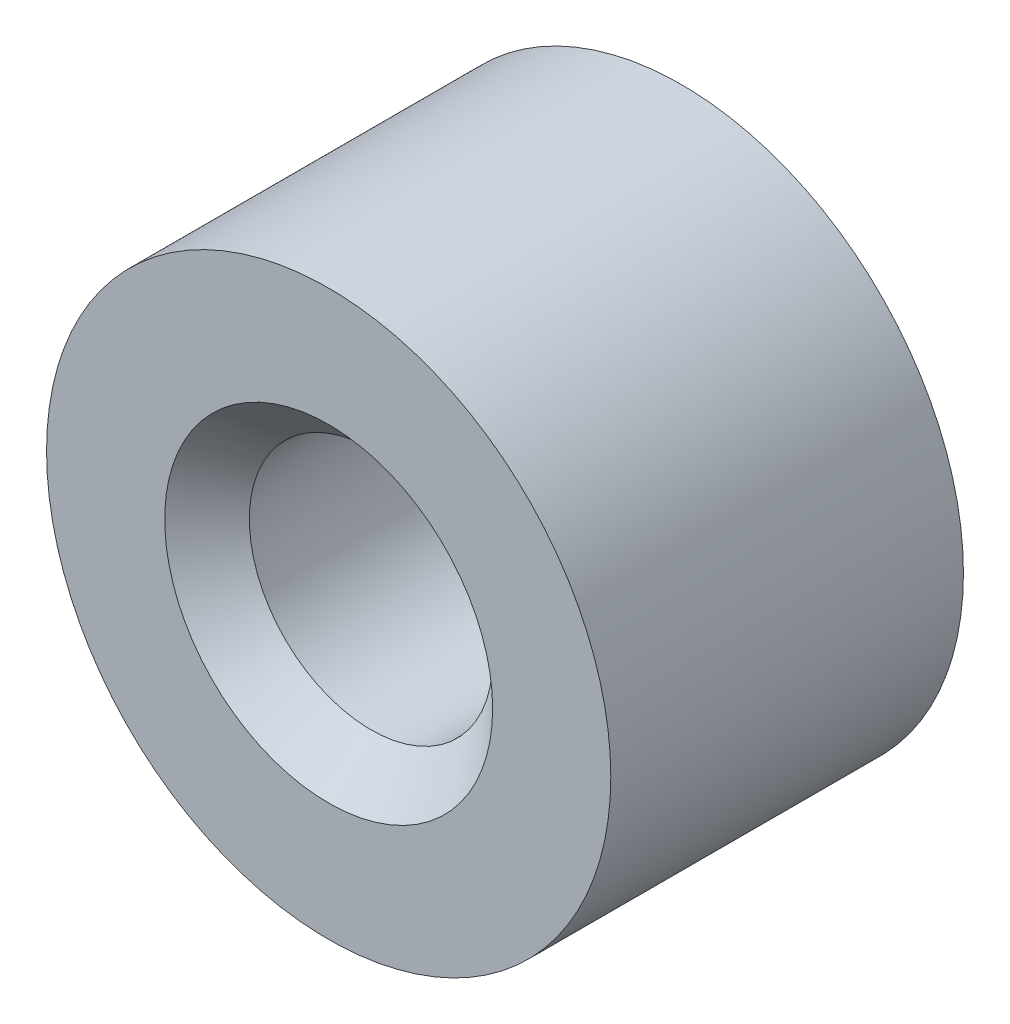
ISO-10303-21;
HEADER;
FILE_DESCRIPTION(('STEP AP214'),'2;1');
FILE_NAME('part.step','',(''),(''),'','','');
FILE_SCHEMA(('AUTOMOTIVE_DESIGN { 1 0 10303 214 1 1 1 1 }'));
ENDSEC;
DATA;
#1=APPLICATION_CONTEXT('core data for automotive mechanical design processes');
#2=APPLICATION_PROTOCOL_DEFINITION('international standard','automotive_design',2000,#1);
#3=PRODUCT_CONTEXT('',#1,'mechanical');
#4=PRODUCT('Part','Part','',(#3));
#5=PRODUCT_RELATED_PRODUCT_CATEGORY('part','',(#4));
#6=PRODUCT_DEFINITION_FORMATION('','',#4);
#7=PRODUCT_DEFINITION_CONTEXT('part definition',#1,'design');
#8=PRODUCT_DEFINITION('design','',#6,#7);
#9=PRODUCT_DEFINITION_SHAPE('','',#8);
#10=(LENGTH_UNIT() NAMED_UNIT(*) SI_UNIT(.MILLI.,.METRE.));
#11=(NAMED_UNIT(*) PLANE_ANGLE_UNIT() SI_UNIT($,.RADIAN.));
#12=(NAMED_UNIT(*) SI_UNIT($,.STERADIAN.) SOLID_ANGLE_UNIT());
#13=UNCERTAINTY_MEASURE_WITH_UNIT(LENGTH_MEASURE(1.E-05),#10,'distance_accuracy_value','');
#14=(GEOMETRIC_REPRESENTATION_CONTEXT(3) GLOBAL_UNCERTAINTY_ASSIGNED_CONTEXT((#13)) GLOBAL_UNIT_ASSIGNED_CONTEXT((#10,
#11,#12)) REPRESENTATION_CONTEXT('',''));
#15=CARTESIAN_POINT('',(0.,0.,0.));
#16=DIRECTION('',(0.,0.,1.));
#17=DIRECTION('',(1.,0.,0.));
#18=AXIS2_PLACEMENT_3D('',#15,#16,#17);
#19=CARTESIAN_POINT('',(0.,0.,-2.5));
#20=DIRECTION('',(0.,0.,-1.));
#21=DIRECTION('',(1.,0.,0.));
#22=AXIS2_PLACEMENT_3D('',#19,#20,#21);
#23=PLANE('',#22);
#24=CARTESIAN_POINT('',(0.,0.,-2.5));
#25=DIRECTION('',(0.,0.,1.));
#26=DIRECTION('',(1.,0.,0.));
#27=AXIS2_PLACEMENT_3D('',#24,#25,#26);
#28=CIRCLE('',#27,2.325);
#29=CARTESIAN_POINT('',(2.325,0.,-2.5));
#30=VERTEX_POINT('',#29);
#31=EDGE_CURVE('E10',#30,#30,#28,.F.);
#32=ORIENTED_EDGE('',*,*,#31,.F.);
#33=EDGE_LOOP('',(#32));
#34=FACE_BOUND('',#33,.T.);
#35=CARTESIAN_POINT('',(0.,0.,-2.5));
#36=DIRECTION('',(0.,0.,1.));
#37=DIRECTION('',(1.,0.,0.));
#38=AXIS2_PLACEMENT_3D('',#35,#36,#37);
#39=CIRCLE('',#38,4.);
#40=CARTESIAN_POINT('',(4.,0.,-2.5));
#41=VERTEX_POINT('',#40);
#42=EDGE_CURVE('E59',#41,#41,#39,.T.);
#43=ORIENTED_EDGE('',*,*,#42,.F.);
#44=EDGE_LOOP('',(#43));
#45=FACE_BOUND('',#44,.T.);
#46=ADVANCED_FACE('F39',(#34,#45),#23,.T.);
#47=CARTESIAN_POINT('',(0.,0.,2.5));
#48=DIRECTION('',(0.,0.,-1.));
#49=DIRECTION('',(1.,0.,0.));
#50=AXIS2_PLACEMENT_3D('',#47,#48,#49);
#51=PLANE('',#50);
#52=CARTESIAN_POINT('',(0.,0.,2.5));
#53=DIRECTION('',(0.,0.,1.));
#54=DIRECTION('',(1.,0.,0.));
#55=AXIS2_PLACEMENT_3D('',#52,#53,#54);
#56=CIRCLE('',#55,2.325);
#57=CARTESIAN_POINT('',(2.325,0.,2.5));
#58=VERTEX_POINT('',#57);
#59=EDGE_CURVE('E54',#58,#58,#56,.T.);
#60=ORIENTED_EDGE('',*,*,#59,.F.);
#61=EDGE_LOOP('',(#60));
#62=FACE_BOUND('',#61,.T.);
#63=CARTESIAN_POINT('',(0.,0.,2.5));
#64=DIRECTION('',(0.,0.,1.));
#65=DIRECTION('',(1.,0.,0.));
#66=AXIS2_PLACEMENT_3D('',#63,#64,#65);
#67=CIRCLE('',#66,4.);
#68=CARTESIAN_POINT('',(4.,0.,2.5));
#69=VERTEX_POINT('',#68);
#70=EDGE_CURVE('E60',#69,#69,#67,.T.);
#71=ORIENTED_EDGE('',*,*,#70,.T.);
#72=EDGE_LOOP('',(#71));
#73=FACE_BOUND('',#72,.T.);
#74=ADVANCED_FACE('F70',(#62,#73),#51,.F.);
#75=CARTESIAN_POINT('',(0.,0.,-2.5));
#76=DIRECTION('',(0.,0.,1.));
#77=DIRECTION('',(-1.,0.,0.));
#78=AXIS2_PLACEMENT_3D('',#75,#76,#77);
#79=CYLINDRICAL_SURFACE('',#78,4.);
#80=ORIENTED_EDGE('',*,*,#42,.T.);
#81=EDGE_LOOP('',(#80));
#82=FACE_BOUND('',#81,.T.);
#83=ORIENTED_EDGE('',*,*,#70,.F.);
#84=EDGE_LOOP('',(#83));
#85=FACE_BOUND('',#84,.T.);
#86=ADVANCED_FACE('F66',(#82,#85),#79,.T.);
#87=CARTESIAN_POINT('',(0.,0.,-2.5));
#88=DIRECTION('',(0.,0.,1.));
#89=DIRECTION('',(-1.,0.,0.));
#90=AXIS2_PLACEMENT_3D('',#87,#88,#89);
#91=CYLINDRICAL_SURFACE('',#90,1.725);
#92=CARTESIAN_POINT('',(0.,0.,1.9));
#93=DIRECTION('',(0.,0.,1.));
#94=DIRECTION('',(1.,0.,0.));
#95=AXIS2_PLACEMENT_3D('',#92,#93,#94);
#96=CIRCLE('',#95,1.725);
#97=CARTESIAN_POINT('',(1.725,0.,1.9));
#98=VERTEX_POINT('',#97);
#99=EDGE_CURVE('E46',#98,#98,#96,.F.);
#100=ORIENTED_EDGE('',*,*,#99,.F.);
#101=EDGE_LOOP('',(#100));
#102=FACE_BOUND('',#101,.T.);
#103=CARTESIAN_POINT('',(0.,0.,-1.9));
#104=DIRECTION('',(0.,0.,1.));
#105=DIRECTION('',(1.,0.,0.));
#106=AXIS2_PLACEMENT_3D('',#103,#104,#105);
#107=CIRCLE('',#106,1.725);
#108=CARTESIAN_POINT('',(1.725,0.,-1.9));
#109=VERTEX_POINT('',#108);
#110=EDGE_CURVE('E50',#109,#109,#107,.T.);
#111=ORIENTED_EDGE('',*,*,#110,.F.);
#112=EDGE_LOOP('',(#111));
#113=FACE_BOUND('',#112,.T.);
#114=ADVANCED_FACE('F79',(#102,#113),#91,.F.);
#115=CARTESIAN_POINT('',(0.,0.,2.5));
#116=DIRECTION('',(0.,0.,1.));
#117=DIRECTION('',(-1.,0.,0.));
#118=AXIS2_PLACEMENT_3D('',#115,#116,#117);
#119=CONICAL_SURFACE('',#118,2.325,0.785398163397447);
#120=ORIENTED_EDGE('',*,*,#99,.T.);
#121=EDGE_LOOP('',(#120));
#122=FACE_BOUND('',#121,.T.);
#123=ORIENTED_EDGE('',*,*,#59,.T.);
#124=EDGE_LOOP('',(#123));
#125=FACE_BOUND('',#124,.T.);
#126=ADVANCED_FACE('F82',(#122,#125),#119,.F.);
#127=CARTESIAN_POINT('',(0.,0.,-1.9));
#128=DIRECTION('',(0.,0.,-1.));
#129=DIRECTION('',(1.,0.,0.));
#130=AXIS2_PLACEMENT_3D('',#127,#128,#129);
#131=CONICAL_SURFACE('',#130,1.725,0.78539816339745);
#132=ORIENTED_EDGE('',*,*,#31,.T.);
#133=EDGE_LOOP('',(#132));
#134=FACE_BOUND('',#133,.T.);
#135=ORIENTED_EDGE('',*,*,#110,.T.);
#136=EDGE_LOOP('',(#135));
#137=FACE_BOUND('',#136,.T.);
#138=ADVANCED_FACE('F41',(#134,#137),#131,.F.);
#139=CLOSED_SHELL('',(#46,#74,#86,#114,#126,#138));
#140=MANIFOLD_SOLID_BREP('B2',#139);
#141=ADVANCED_BREP_SHAPE_REPRESENTATION('',(#18,#140),#14);
#142=SHAPE_DEFINITION_REPRESENTATION(#9,#141);
ENDSEC;
END-ISO-10303-21;
